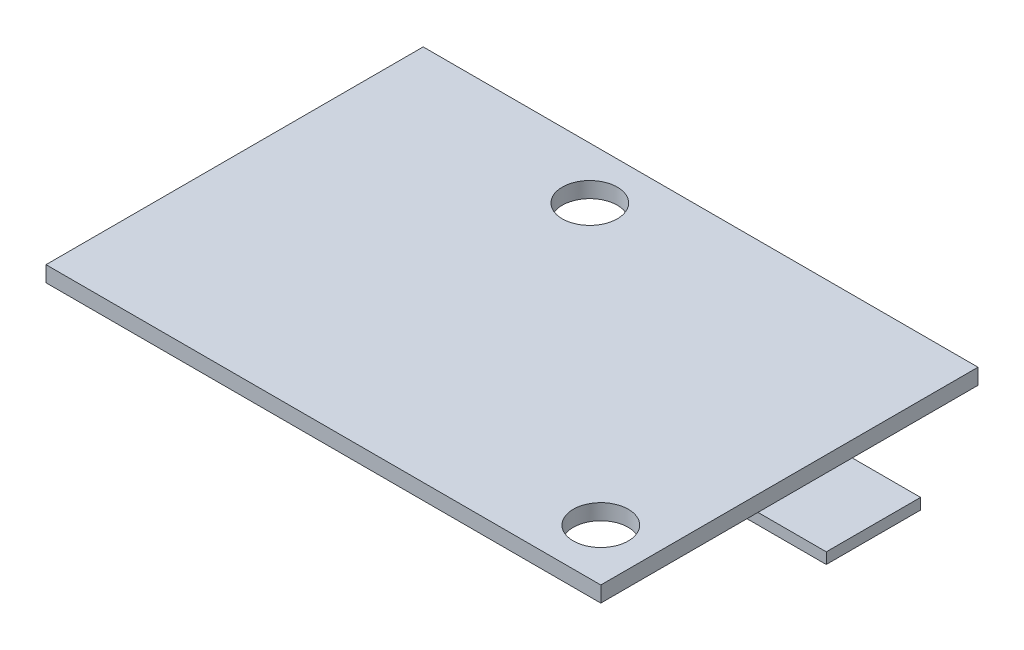
ISO-10303-21;
HEADER;
FILE_DESCRIPTION(('STEP AP214'),'2;1');
FILE_NAME('part.step','',(''),(''),'','','');
FILE_SCHEMA(('AUTOMOTIVE_DESIGN { 1 0 10303 214 1 1 1 1 }'));
ENDSEC;
DATA;
#1=APPLICATION_CONTEXT('core data for automotive mechanical design processes');
#2=APPLICATION_PROTOCOL_DEFINITION('international standard','automotive_design',2000,#1);
#3=PRODUCT_CONTEXT('',#1,'mechanical');
#4=PRODUCT('Part','Part','',(#3));
#5=PRODUCT_RELATED_PRODUCT_CATEGORY('part','',(#4));
#6=PRODUCT_DEFINITION_FORMATION('','',#4);
#7=PRODUCT_DEFINITION_CONTEXT('part definition',#1,'design');
#8=PRODUCT_DEFINITION('design','',#6,#7);
#9=PRODUCT_DEFINITION_SHAPE('','',#8);
#10=(LENGTH_UNIT() NAMED_UNIT(*) SI_UNIT(.MILLI.,.METRE.));
#11=(NAMED_UNIT(*) PLANE_ANGLE_UNIT() SI_UNIT($,.RADIAN.));
#12=(NAMED_UNIT(*) SI_UNIT($,.STERADIAN.) SOLID_ANGLE_UNIT());
#13=UNCERTAINTY_MEASURE_WITH_UNIT(LENGTH_MEASURE(1.E-05),#10,'distance_accuracy_value','');
#14=(GEOMETRIC_REPRESENTATION_CONTEXT(3) GLOBAL_UNCERTAINTY_ASSIGNED_CONTEXT((#13)) GLOBAL_UNIT_ASSIGNED_CONTEXT((#10,
#11,#12)) REPRESENTATION_CONTEXT('',''));
#15=CARTESIAN_POINT('',(0.,0.,0.));
#16=DIRECTION('',(0.,0.,1.));
#17=DIRECTION('',(1.,0.,0.));
#18=AXIS2_PLACEMENT_3D('',#15,#16,#17);
#19=CARTESIAN_POINT('',(17.65,1.,12.));
#20=DIRECTION('',(-1.,0.,0.));
#21=DIRECTION('',(0.,0.,1.));
#22=AXIS2_PLACEMENT_3D('',#19,#20,#21);
#23=PLANE('',#22);
#24=DIRECTION('',(0.,0.,-1.));
#25=VECTOR('',#24,1.);
#26=CARTESIAN_POINT('',(17.65,0.,12.));
#27=LINE('',#26,#25);
#28=CARTESIAN_POINT('',(17.65,0.,12.));
#29=VERTEX_POINT('',#28);
#30=CARTESIAN_POINT('',(17.65,0.,2.));
#31=VERTEX_POINT('',#30);
#32=EDGE_CURVE('E154',#29,#31,#27,.T.);
#33=ORIENTED_EDGE('',*,*,#32,.T.);
#34=CARTESIAN_POINT('',(17.65,0.,-4.));
#35=VERTEX_POINT('',#34);
#36=EDGE_CURVE('E158',#31,#35,#27,.T.);
#37=ORIENTED_EDGE('',*,*,#36,.T.);
#38=CARTESIAN_POINT('',(17.65,0.,-12.));
#39=VERTEX_POINT('',#38);
#40=EDGE_CURVE('E142',#35,#39,#27,.T.);
#41=ORIENTED_EDGE('',*,*,#40,.T.);
#42=DIRECTION('',(0.,-1.,0.));
#43=VECTOR('',#42,1.);
#44=CARTESIAN_POINT('',(17.65,1.,-12.));
#45=LINE('',#44,#43);
#46=CARTESIAN_POINT('',(17.65,1.,-12.));
#47=VERTEX_POINT('',#46);
#48=EDGE_CURVE('E37',#47,#39,#45,.T.);
#49=ORIENTED_EDGE('',*,*,#48,.F.);
#50=DIRECTION('',(0.,0.,-1.));
#51=VECTOR('',#50,1.);
#52=CARTESIAN_POINT('',(17.65,1.,12.));
#53=LINE('',#52,#51);
#54=CARTESIAN_POINT('',(17.65,1.,12.));
#55=VERTEX_POINT('',#54);
#56=EDGE_CURVE('E143',#55,#47,#53,.T.);
#57=ORIENTED_EDGE('',*,*,#56,.F.);
#58=DIRECTION('',(0.,-1.,0.));
#59=VECTOR('',#58,1.);
#60=CARTESIAN_POINT('',(17.65,1.,12.));
#61=LINE('',#60,#59);
#62=EDGE_CURVE('E153',#55,#29,#61,.T.);
#63=ORIENTED_EDGE('',*,*,#62,.T.);
#64=EDGE_LOOP('',(#33,#37,#41,#49,#57,#63));
#65=FACE_BOUND('',#64,.T.);
#66=ADVANCED_FACE('F34',(#65),#23,.F.);
#67=CARTESIAN_POINT('',(-17.65,1.,-12.));
#68=DIRECTION('',(0.,0.,1.));
#69=DIRECTION('',(1.,0.,0.));
#70=AXIS2_PLACEMENT_3D('',#67,#68,#69);
#71=PLANE('',#70);
#72=DIRECTION('',(-1.,0.,0.));
#73=VECTOR('',#72,1.);
#74=CARTESIAN_POINT('',(-17.65,0.,-12.));
#75=LINE('',#74,#73);
#76=CARTESIAN_POINT('',(-17.65,0.,-12.));
#77=VERTEX_POINT('',#76);
#78=EDGE_CURVE('E157',#39,#77,#75,.T.);
#79=ORIENTED_EDGE('',*,*,#78,.T.);
#80=DIRECTION('',(0.,-1.,0.));
#81=VECTOR('',#80,1.);
#82=CARTESIAN_POINT('',(-17.65,1.,-12.));
#83=LINE('',#82,#81);
#84=CARTESIAN_POINT('',(-17.65,1.,-12.));
#85=VERTEX_POINT('',#84);
#86=EDGE_CURVE('E167',#85,#77,#83,.T.);
#87=ORIENTED_EDGE('',*,*,#86,.F.);
#88=DIRECTION('',(-1.,0.,0.));
#89=VECTOR('',#88,1.);
#90=CARTESIAN_POINT('',(-17.65,1.,-12.));
#91=LINE('',#90,#89);
#92=EDGE_CURVE('E146',#47,#85,#91,.T.);
#93=ORIENTED_EDGE('',*,*,#92,.F.);
#94=ORIENTED_EDGE('',*,*,#48,.T.);
#95=EDGE_LOOP('',(#79,#87,#93,#94));
#96=FACE_BOUND('',#95,.T.);
#97=ADVANCED_FACE('F176',(#96),#71,.F.);
#98=CARTESIAN_POINT('',(-17.65,1.,12.));
#99=DIRECTION('',(1.,0.,0.));
#100=DIRECTION('',(0.,0.,-1.));
#101=AXIS2_PLACEMENT_3D('',#98,#99,#100);
#102=PLANE('',#101);
#103=DIRECTION('',(0.,0.,1.));
#104=VECTOR('',#103,1.);
#105=CARTESIAN_POINT('',(-17.65,0.,12.));
#106=LINE('',#105,#104);
#107=CARTESIAN_POINT('',(-17.65,0.,12.));
#108=VERTEX_POINT('',#107);
#109=EDGE_CURVE('E160',#77,#108,#106,.T.);
#110=ORIENTED_EDGE('',*,*,#109,.T.);
#111=DIRECTION('',(0.,-1.,0.));
#112=VECTOR('',#111,1.);
#113=CARTESIAN_POINT('',(-17.65,1.,12.));
#114=LINE('',#113,#112);
#115=CARTESIAN_POINT('',(-17.65,1.,12.));
#116=VERTEX_POINT('',#115);
#117=EDGE_CURVE('E165',#116,#108,#114,.T.);
#118=ORIENTED_EDGE('',*,*,#117,.F.);
#119=DIRECTION('',(0.,0.,1.));
#120=VECTOR('',#119,1.);
#121=CARTESIAN_POINT('',(-17.65,1.,12.));
#122=LINE('',#121,#120);
#123=EDGE_CURVE('E149',#85,#116,#122,.T.);
#124=ORIENTED_EDGE('',*,*,#123,.F.);
#125=ORIENTED_EDGE('',*,*,#86,.T.);
#126=EDGE_LOOP('',(#110,#118,#124,#125));
#127=FACE_BOUND('',#126,.T.);
#128=ADVANCED_FACE('F187',(#127),#102,.F.);
#129=CARTESIAN_POINT('',(-17.65,1.,12.));
#130=DIRECTION('',(0.,0.,-1.));
#131=DIRECTION('',(-1.,0.,0.));
#132=AXIS2_PLACEMENT_3D('',#129,#130,#131);
#133=PLANE('',#132);
#134=DIRECTION('',(1.,0.,0.));
#135=VECTOR('',#134,1.);
#136=CARTESIAN_POINT('',(-17.65,0.,12.));
#137=LINE('',#136,#135);
#138=EDGE_CURVE('E147',#108,#29,#137,.T.);
#139=ORIENTED_EDGE('',*,*,#138,.T.);
#140=ORIENTED_EDGE('',*,*,#62,.F.);
#141=DIRECTION('',(1.,0.,0.));
#142=VECTOR('',#141,1.);
#143=CARTESIAN_POINT('',(-17.65,1.,12.));
#144=LINE('',#143,#142);
#145=EDGE_CURVE('E151',#116,#55,#144,.T.);
#146=ORIENTED_EDGE('',*,*,#145,.F.);
#147=ORIENTED_EDGE('',*,*,#117,.T.);
#148=EDGE_LOOP('',(#139,#140,#146,#147));
#149=FACE_BOUND('',#148,.T.);
#150=ADVANCED_FACE('F190',(#149),#133,.F.);
#151=CARTESIAN_POINT('',(0.,1.,0.));
#152=DIRECTION('',(0.,-1.,0.));
#153=DIRECTION('',(0.,0.,-1.));
#154=AXIS2_PLACEMENT_3D('',#151,#152,#153);
#155=PLANE('',#154);
#156=CARTESIAN_POINT('',(-3.75,1.,-8.7));
#157=DIRECTION('',(0.,1.,0.));
#158=DIRECTION('',(0.,0.,1.));
#159=AXIS2_PLACEMENT_3D('',#156,#157,#158);
#160=CIRCLE('',#159,1.75);
#161=CARTESIAN_POINT('',(-3.75,1.,-6.95));
#162=VERTEX_POINT('',#161);
#163=EDGE_CURVE('E125',#162,#162,#160,.T.);
#164=ORIENTED_EDGE('',*,*,#163,.F.);
#165=EDGE_LOOP('',(#164));
#166=FACE_BOUND('',#165,.T.);
#167=CARTESIAN_POINT('',(14.35,1.,8.7));
#168=DIRECTION('',(0.,1.,0.));
#169=DIRECTION('',(0.,0.,1.));
#170=AXIS2_PLACEMENT_3D('',#167,#168,#169);
#171=CIRCLE('',#170,1.75);
#172=CARTESIAN_POINT('',(14.35,1.,10.45));
#173=VERTEX_POINT('',#172);
#174=EDGE_CURVE('E136',#173,#173,#171,.T.);
#175=ORIENTED_EDGE('',*,*,#174,.F.);
#176=EDGE_LOOP('',(#175));
#177=FACE_BOUND('',#176,.T.);
#178=ORIENTED_EDGE('',*,*,#56,.T.);
#179=ORIENTED_EDGE('',*,*,#92,.T.);
#180=ORIENTED_EDGE('',*,*,#123,.T.);
#181=ORIENTED_EDGE('',*,*,#145,.T.);
#182=EDGE_LOOP('',(#178,#179,#180,#181));
#183=FACE_BOUND('',#182,.T.);
#184=ADVANCED_FACE('F193',(#166,#177,#183),#155,.F.);
#185=CARTESIAN_POINT('',(0.,0.,0.));
#186=DIRECTION('',(0.,-1.,0.));
#187=DIRECTION('',(0.,0.,-1.));
#188=AXIS2_PLACEMENT_3D('',#185,#186,#187);
#189=PLANE('',#188);
#190=DIRECTION('',(-1.,0.,0.));
#191=VECTOR('',#190,1.);
#192=CARTESIAN_POINT('',(14.866396531945,0.,2.));
#193=LINE('',#192,#191);
#194=CARTESIAN_POINT('',(14.866396531945,0.,2.));
#195=VERTEX_POINT('',#194);
#196=EDGE_CURVE('E11',#31,#195,#193,.T.);
#197=ORIENTED_EDGE('',*,*,#196,.F.);
#198=ORIENTED_EDGE('',*,*,#32,.F.);
#199=ORIENTED_EDGE('',*,*,#138,.F.);
#200=ORIENTED_EDGE('',*,*,#109,.F.);
#201=ORIENTED_EDGE('',*,*,#78,.F.);
#202=ORIENTED_EDGE('',*,*,#40,.F.);
#203=DIRECTION('',(1.,0.,0.));
#204=VECTOR('',#203,1.);
#205=CARTESIAN_POINT('',(14.866396531945,0.,-4.));
#206=LINE('',#205,#204);
#207=CARTESIAN_POINT('',(14.866396531945,0.,-4.));
#208=VERTEX_POINT('',#207);
#209=EDGE_CURVE('E54',#208,#35,#206,.T.);
#210=ORIENTED_EDGE('',*,*,#209,.F.);
#211=DIRECTION('',(0.,0.,-1.));
#212=VECTOR('',#211,1.);
#213=CARTESIAN_POINT('',(14.866396531945,0.,2.));
#214=LINE('',#213,#212);
#215=EDGE_CURVE('E50',#195,#208,#214,.T.);
#216=ORIENTED_EDGE('',*,*,#215,.F.);
#217=EDGE_LOOP('',(#197,#198,#199,#200,#201,#202,#210,#216));
#218=FACE_BOUND('',#217,.T.);
#219=CARTESIAN_POINT('',(-3.75,0.,-8.7));
#220=DIRECTION('',(0.,-1.,0.));
#221=DIRECTION('',(0.,0.,-1.));
#222=AXIS2_PLACEMENT_3D('',#219,#220,#221);
#223=CIRCLE('',#222,1.75);
#224=CARTESIAN_POINT('',(-3.75,0.,-10.45));
#225=VERTEX_POINT('',#224);
#226=EDGE_CURVE('E128',#225,#225,#223,.T.);
#227=ORIENTED_EDGE('',*,*,#226,.F.);
#228=EDGE_LOOP('',(#227));
#229=FACE_BOUND('',#228,.T.);
#230=CARTESIAN_POINT('',(14.35,0.,8.7));
#231=DIRECTION('',(0.,-1.,0.));
#232=DIRECTION('',(0.,0.,-1.));
#233=AXIS2_PLACEMENT_3D('',#230,#231,#232);
#234=CIRCLE('',#233,1.75);
#235=CARTESIAN_POINT('',(14.35,0.,6.95));
#236=VERTEX_POINT('',#235);
#237=EDGE_CURVE('E139',#236,#236,#234,.T.);
#238=ORIENTED_EDGE('',*,*,#237,.F.);
#239=EDGE_LOOP('',(#238));
#240=FACE_BOUND('',#239,.T.);
#241=ADVANCED_FACE('F182',(#218,#229,#240),#189,.T.);
#242=CARTESIAN_POINT('',(14.35,1.,8.7));
#243=DIRECTION('',(0.,1.,0.));
#244=DIRECTION('',(0.,0.,1.));
#245=AXIS2_PLACEMENT_3D('',#242,#243,#244);
#246=CYLINDRICAL_SURFACE('',#245,1.75);
#247=ORIENTED_EDGE('',*,*,#174,.T.);
#248=EDGE_LOOP('',(#247));
#249=FACE_BOUND('',#248,.T.);
#250=ORIENTED_EDGE('',*,*,#237,.T.);
#251=EDGE_LOOP('',(#250));
#252=FACE_BOUND('',#251,.T.);
#253=ADVANCED_FACE('F201',(#249,#252),#246,.F.);
#254=CARTESIAN_POINT('',(-3.75,1.,-8.7));
#255=DIRECTION('',(0.,1.,0.));
#256=DIRECTION('',(0.,0.,1.));
#257=AXIS2_PLACEMENT_3D('',#254,#255,#256);
#258=CYLINDRICAL_SURFACE('',#257,1.75);
#259=ORIENTED_EDGE('',*,*,#163,.T.);
#260=EDGE_LOOP('',(#259));
#261=FACE_BOUND('',#260,.T.);
#262=ORIENTED_EDGE('',*,*,#226,.T.);
#263=EDGE_LOOP('',(#262));
#264=FACE_BOUND('',#263,.T.);
#265=ADVANCED_FACE('F235',(#261,#264),#258,.F.);
#266=CARTESIAN_POINT('',(14.866396531945,-0.7,2.));
#267=DIRECTION('',(1.,0.,0.));
#268=DIRECTION('',(0.,0.,-1.));
#269=AXIS2_PLACEMENT_3D('',#266,#267,#268);
#270=PLANE('',#269);
#271=ORIENTED_EDGE('',*,*,#215,.T.);
#272=DIRECTION('',(0.,1.,0.));
#273=VECTOR('',#272,1.);
#274=CARTESIAN_POINT('',(14.866396531945,-0.7,-4.));
#275=LINE('',#274,#273);
#276=CARTESIAN_POINT('',(14.866396531945,-0.7,-4.));
#277=VERTEX_POINT('',#276);
#278=EDGE_CURVE('E108',#277,#208,#275,.T.);
#279=ORIENTED_EDGE('',*,*,#278,.F.);
#280=DIRECTION('',(0.,0.,-1.));
#281=VECTOR('',#280,1.);
#282=CARTESIAN_POINT('',(14.866396531945,-0.7,2.));
#283=LINE('',#282,#281);
#284=CARTESIAN_POINT('',(14.866396531945,-0.7,2.));
#285=VERTEX_POINT('',#284);
#286=EDGE_CURVE('E114',#285,#277,#283,.T.);
#287=ORIENTED_EDGE('',*,*,#286,.F.);
#288=DIRECTION('',(0.,1.,0.));
#289=VECTOR('',#288,1.);
#290=CARTESIAN_POINT('',(14.866396531945,-0.7,2.));
#291=LINE('',#290,#289);
#292=EDGE_CURVE('E322',#285,#195,#291,.T.);
#293=ORIENTED_EDGE('',*,*,#292,.T.);
#294=EDGE_LOOP('',(#271,#279,#287,#293));
#295=FACE_BOUND('',#294,.T.);
#296=ADVANCED_FACE('F124',(#295),#270,.F.);
#297=CARTESIAN_POINT('',(14.866396531945,-0.7,-4.));
#298=DIRECTION('',(0.,0.,1.));
#299=DIRECTION('',(1.,0.,0.));
#300=AXIS2_PLACEMENT_3D('',#297,#298,#299);
#301=PLANE('',#300);
#302=ORIENTED_EDGE('',*,*,#209,.T.);
#303=CARTESIAN_POINT('',(21.9960479631567,0.,-4.));
#304=VERTEX_POINT('',#303);
#305=EDGE_CURVE('E315',#35,#304,#206,.T.);
#306=ORIENTED_EDGE('',*,*,#305,.T.);
#307=DIRECTION('',(0.,1.,0.));
#308=VECTOR('',#307,1.);
#309=CARTESIAN_POINT('',(21.9960479631567,-0.7,-4.));
#310=LINE('',#309,#308);
#311=CARTESIAN_POINT('',(21.9960479631567,-0.7,-4.));
#312=VERTEX_POINT('',#311);
#313=EDGE_CURVE('E110',#312,#304,#310,.T.);
#314=ORIENTED_EDGE('',*,*,#313,.F.);
#315=DIRECTION('',(1.,0.,0.));
#316=VECTOR('',#315,1.);
#317=CARTESIAN_POINT('',(14.866396531945,-0.7,-4.));
#318=LINE('',#317,#316);
#319=EDGE_CURVE('E104',#277,#312,#318,.T.);
#320=ORIENTED_EDGE('',*,*,#319,.F.);
#321=ORIENTED_EDGE('',*,*,#278,.T.);
#322=EDGE_LOOP('',(#302,#306,#314,#320,#321));
#323=FACE_BOUND('',#322,.T.);
#324=ADVANCED_FACE('F106',(#323),#301,.F.);
#325=CARTESIAN_POINT('',(21.9960479631567,-0.7,2.));
#326=DIRECTION('',(-1.,0.,0.));
#327=DIRECTION('',(0.,0.,1.));
#328=AXIS2_PLACEMENT_3D('',#325,#326,#327);
#329=PLANE('',#328);
#330=DIRECTION('',(0.,0.,1.));
#331=VECTOR('',#330,1.);
#332=CARTESIAN_POINT('',(21.9960479631567,0.,2.));
#333=LINE('',#332,#331);
#334=CARTESIAN_POINT('',(21.9960479631567,0.,2.));
#335=VERTEX_POINT('',#334);
#336=EDGE_CURVE('E318',#304,#335,#333,.T.);
#337=ORIENTED_EDGE('',*,*,#336,.T.);
#338=DIRECTION('',(0.,1.,0.));
#339=VECTOR('',#338,1.);
#340=CARTESIAN_POINT('',(21.9960479631567,-0.7,2.));
#341=LINE('',#340,#339);
#342=CARTESIAN_POINT('',(21.9960479631567,-0.7,2.));
#343=VERTEX_POINT('',#342);
#344=EDGE_CURVE('E130',#343,#335,#341,.T.);
#345=ORIENTED_EDGE('',*,*,#344,.F.);
#346=DIRECTION('',(0.,0.,1.));
#347=VECTOR('',#346,1.);
#348=CARTESIAN_POINT('',(21.9960479631567,-0.7,2.));
#349=LINE('',#348,#347);
#350=EDGE_CURVE('E113',#312,#343,#349,.T.);
#351=ORIENTED_EDGE('',*,*,#350,.F.);
#352=ORIENTED_EDGE('',*,*,#313,.T.);
#353=EDGE_LOOP('',(#337,#345,#351,#352));
#354=FACE_BOUND('',#353,.T.);
#355=ADVANCED_FACE('F271',(#354),#329,.F.);
#356=CARTESIAN_POINT('',(14.866396531945,-0.7,2.));
#357=DIRECTION('',(0.,0.,-1.));
#358=DIRECTION('',(-1.,0.,0.));
#359=AXIS2_PLACEMENT_3D('',#356,#357,#358);
#360=PLANE('',#359);
#361=EDGE_CURVE('E43',#335,#31,#193,.T.);
#362=ORIENTED_EDGE('',*,*,#361,.T.);
#363=ORIENTED_EDGE('',*,*,#196,.T.);
#364=ORIENTED_EDGE('',*,*,#292,.F.);
#365=DIRECTION('',(-1.,0.,0.));
#366=VECTOR('',#365,1.);
#367=CARTESIAN_POINT('',(14.866396531945,-0.7,2.));
#368=LINE('',#367,#366);
#369=EDGE_CURVE('E119',#343,#285,#368,.T.);
#370=ORIENTED_EDGE('',*,*,#369,.F.);
#371=ORIENTED_EDGE('',*,*,#344,.T.);
#372=EDGE_LOOP('',(#362,#363,#364,#370,#371));
#373=FACE_BOUND('',#372,.T.);
#374=ADVANCED_FACE('F280',(#373),#360,.F.);
#375=CARTESIAN_POINT('',(0.,-0.7,0.));
#376=DIRECTION('',(0.,-1.,0.));
#377=DIRECTION('',(0.,0.,-1.));
#378=AXIS2_PLACEMENT_3D('',#375,#376,#377);
#379=PLANE('',#378);
#380=ORIENTED_EDGE('',*,*,#286,.T.);
#381=ORIENTED_EDGE('',*,*,#319,.T.);
#382=ORIENTED_EDGE('',*,*,#350,.T.);
#383=ORIENTED_EDGE('',*,*,#369,.T.);
#384=EDGE_LOOP('',(#380,#381,#382,#383));
#385=FACE_BOUND('',#384,.T.);
#386=ADVANCED_FACE('F117',(#385),#379,.T.);
#387=CARTESIAN_POINT('',(0.,0.,0.));
#388=DIRECTION('',(0.,-1.,0.));
#389=DIRECTION('',(0.,0.,-1.));
#390=AXIS2_PLACEMENT_3D('',#387,#388,#389);
#391=PLANE('',#390);
#392=ORIENTED_EDGE('',*,*,#36,.F.);
#393=ORIENTED_EDGE('',*,*,#361,.F.);
#394=ORIENTED_EDGE('',*,*,#336,.F.);
#395=ORIENTED_EDGE('',*,*,#305,.F.);
#396=EDGE_LOOP('',(#392,#393,#394,#395));
#397=FACE_BOUND('',#396,.T.);
#398=ADVANCED_FACE('F299',(#397),#391,.F.);
#399=CLOSED_SHELL('',(#66,#97,#128,#150,#184,#241,#253,#265,#296,#324,#355,#374,#386,#398));
#400=MANIFOLD_SOLID_BREP('B2',#399);
#401=ADVANCED_BREP_SHAPE_REPRESENTATION('',(#18,#400),#14);
#402=SHAPE_DEFINITION_REPRESENTATION(#9,#401);
ENDSEC;
END-ISO-10303-21;
